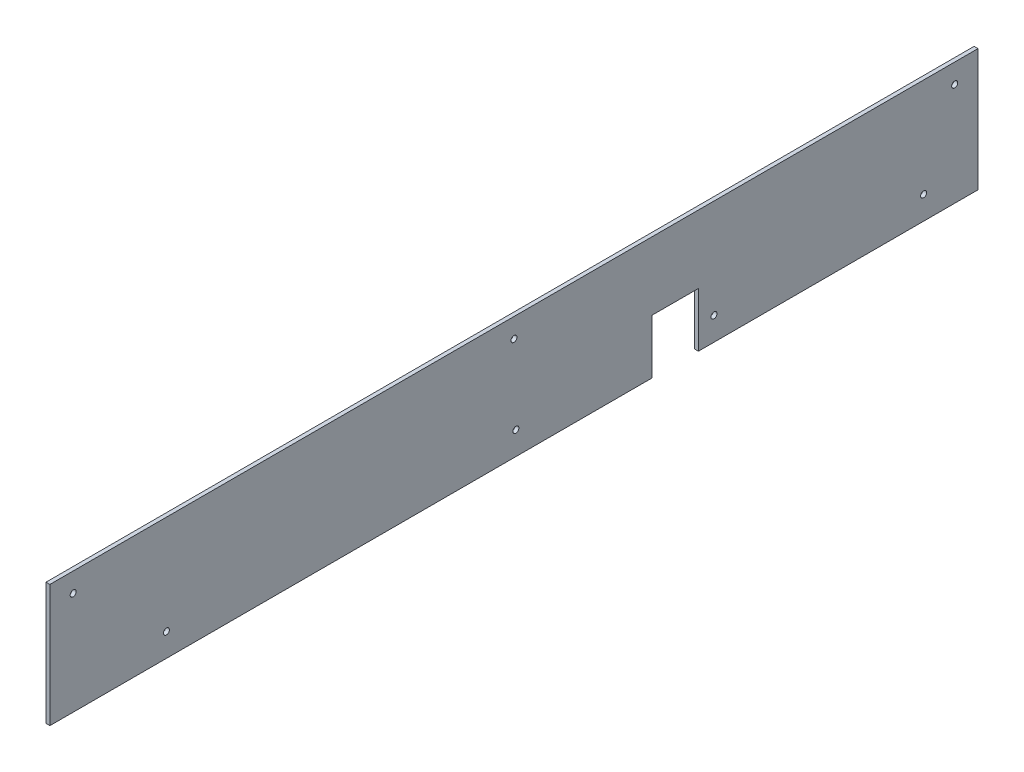
ISO-10303-21;
HEADER;
FILE_DESCRIPTION(('STEP AP214'),'2;1');
FILE_NAME('part.step','',(''),(''),'','','');
FILE_SCHEMA(('AUTOMOTIVE_DESIGN { 1 0 10303 214 1 1 1 1 }'));
ENDSEC;
DATA;
#1=APPLICATION_CONTEXT('core data for automotive mechanical design processes');
#2=APPLICATION_PROTOCOL_DEFINITION('international standard','automotive_design',2000,#1);
#3=PRODUCT_CONTEXT('',#1,'mechanical');
#4=PRODUCT('Part','Part','',(#3));
#5=PRODUCT_RELATED_PRODUCT_CATEGORY('part','',(#4));
#6=PRODUCT_DEFINITION_FORMATION('','',#4);
#7=PRODUCT_DEFINITION_CONTEXT('part definition',#1,'design');
#8=PRODUCT_DEFINITION('design','',#6,#7);
#9=PRODUCT_DEFINITION_SHAPE('','',#8);
#10=(LENGTH_UNIT() NAMED_UNIT(*) SI_UNIT(.MILLI.,.METRE.));
#11=(NAMED_UNIT(*) PLANE_ANGLE_UNIT() SI_UNIT($,.RADIAN.));
#12=(NAMED_UNIT(*) SI_UNIT($,.STERADIAN.) SOLID_ANGLE_UNIT());
#13=UNCERTAINTY_MEASURE_WITH_UNIT(LENGTH_MEASURE(1.E-05),#10,'distance_accuracy_value','');
#14=(GEOMETRIC_REPRESENTATION_CONTEXT(3) GLOBAL_UNCERTAINTY_ASSIGNED_CONTEXT((#13)) GLOBAL_UNIT_ASSIGNED_CONTEXT((#10,
#11,#12)) REPRESENTATION_CONTEXT('',''));
#15=CARTESIAN_POINT('',(0.,0.,0.));
#16=DIRECTION('',(0.,0.,1.));
#17=DIRECTION('',(1.,0.,0.));
#18=AXIS2_PLACEMENT_3D('',#15,#16,#17);
#19=CARTESIAN_POINT('',(3.175,0.,0.));
#20=DIRECTION('',(0.,1.,0.));
#21=DIRECTION('',(0.,0.,1.));
#22=AXIS2_PLACEMENT_3D('',#19,#20,#21);
#23=PLANE('',#22);
#24=DIRECTION('',(0.,0.,-1.));
#25=VECTOR('',#24,1.);
#26=CARTESIAN_POINT('',(0.,0.,0.));
#27=LINE('',#26,#25);
#28=CARTESIAN_POINT('',(0.,0.,0.));
#29=VERTEX_POINT('',#28);
#30=CARTESIAN_POINT('',(0.,0.,-492.125));
#31=VERTEX_POINT('',#30);
#32=EDGE_CURVE('E142',#29,#31,#27,.T.);
#33=ORIENTED_EDGE('',*,*,#32,.T.);
#34=DIRECTION('',(1.,0.,0.));
#35=VECTOR('',#34,1.);
#36=CARTESIAN_POINT('',(-250.825,0.,-492.125));
#37=LINE('',#36,#35);
#38=CARTESIAN_POINT('',(3.175,0.,-492.125));
#39=VERTEX_POINT('',#38);
#40=EDGE_CURVE('E176',#31,#39,#37,.T.);
#41=ORIENTED_EDGE('',*,*,#40,.T.);
#42=DIRECTION('',(0.,0.,-1.));
#43=VECTOR('',#42,1.);
#44=CARTESIAN_POINT('',(3.175,0.,0.));
#45=LINE('',#44,#43);
#46=CARTESIAN_POINT('',(3.175,0.,0.));
#47=VERTEX_POINT('',#46);
#48=EDGE_CURVE('E85',#47,#39,#45,.T.);
#49=ORIENTED_EDGE('',*,*,#48,.F.);
#50=DIRECTION('',(-1.,0.,0.));
#51=VECTOR('',#50,1.);
#52=CARTESIAN_POINT('',(3.175,0.,0.));
#53=LINE('',#52,#51);
#54=EDGE_CURVE('E152',#47,#29,#53,.T.);
#55=ORIENTED_EDGE('',*,*,#54,.T.);
#56=EDGE_LOOP('',(#33,#41,#49,#55));
#57=FACE_BOUND('',#56,.T.);
#58=ADVANCED_FACE('F32',(#57),#23,.F.);
#59=CARTESIAN_POINT('',(3.175,0.,0.));
#60=DIRECTION('',(0.,0.,-1.));
#61=DIRECTION('',(-1.,0.,0.));
#62=AXIS2_PLACEMENT_3D('',#59,#60,#61);
#63=PLANE('',#62);
#64=DIRECTION('',(0.,-1.,0.));
#65=VECTOR('',#64,1.);
#66=CARTESIAN_POINT('',(0.,0.,0.));
#67=LINE('',#66,#65);
#68=CARTESIAN_POINT('',(0.,100.0125,0.));
#69=VERTEX_POINT('',#68);
#70=EDGE_CURVE('E137',#69,#29,#67,.T.);
#71=ORIENTED_EDGE('',*,*,#70,.T.);
#72=ORIENTED_EDGE('',*,*,#54,.F.);
#73=DIRECTION('',(0.,-1.,0.));
#74=VECTOR('',#73,1.);
#75=CARTESIAN_POINT('',(3.175,0.,0.));
#76=LINE('',#75,#74);
#77=CARTESIAN_POINT('',(3.175,100.0125,0.));
#78=VERTEX_POINT('',#77);
#79=EDGE_CURVE('E128',#78,#47,#76,.T.);
#80=ORIENTED_EDGE('',*,*,#79,.F.);
#81=DIRECTION('',(-1.,0.,0.));
#82=VECTOR('',#81,1.);
#83=CARTESIAN_POINT('',(3.175,100.0125,0.));
#84=LINE('',#83,#82);
#85=EDGE_CURVE('E136',#78,#69,#84,.T.);
#86=ORIENTED_EDGE('',*,*,#85,.T.);
#87=EDGE_LOOP('',(#71,#72,#80,#86));
#88=FACE_BOUND('',#87,.T.);
#89=ADVANCED_FACE('F34',(#88),#63,.F.);
#90=CARTESIAN_POINT('',(3.175,0.,-530.225));
#91=VERTEX_POINT('',#90);
#92=CARTESIAN_POINT('',(3.175,0.,-758.825));
#93=VERTEX_POINT('',#92);
#94=EDGE_CURVE('E118',#91,#93,#45,.T.);
#95=ORIENTED_EDGE('',*,*,#94,.F.);
#96=DIRECTION('',(1.,0.,0.));
#97=VECTOR('',#96,1.);
#98=CARTESIAN_POINT('',(-250.825,0.,-530.225));
#99=LINE('',#98,#97);
#100=CARTESIAN_POINT('',(0.,0.,-530.225));
#101=VERTEX_POINT('',#100);
#102=EDGE_CURVE('E105',#101,#91,#99,.T.);
#103=ORIENTED_EDGE('',*,*,#102,.F.);
#104=CARTESIAN_POINT('',(0.,0.,-758.825));
#105=VERTEX_POINT('',#104);
#106=EDGE_CURVE('E140',#101,#105,#27,.T.);
#107=ORIENTED_EDGE('',*,*,#106,.T.);
#108=DIRECTION('',(-1.,0.,0.));
#109=VECTOR('',#108,1.);
#110=CARTESIAN_POINT('',(3.175,0.,-758.825));
#111=LINE('',#110,#109);
#112=EDGE_CURVE('E126',#93,#105,#111,.T.);
#113=ORIENTED_EDGE('',*,*,#112,.F.);
#114=EDGE_LOOP('',(#95,#103,#107,#113));
#115=FACE_BOUND('',#114,.T.);
#116=ADVANCED_FACE('F124',(#115),#23,.F.);
#117=CARTESIAN_POINT('',(3.175,0.,-758.825));
#118=DIRECTION('',(0.,0.,1.));
#119=DIRECTION('',(1.,0.,0.));
#120=AXIS2_PLACEMENT_3D('',#117,#118,#119);
#121=PLANE('',#120);
#122=DIRECTION('',(0.,1.,0.));
#123=VECTOR('',#122,1.);
#124=CARTESIAN_POINT('',(0.,0.,-758.825));
#125=LINE('',#124,#123);
#126=CARTESIAN_POINT('',(0.,100.0125,-758.825));
#127=VERTEX_POINT('',#126);
#128=EDGE_CURVE('E145',#105,#127,#125,.T.);
#129=ORIENTED_EDGE('',*,*,#128,.T.);
#130=DIRECTION('',(-1.,0.,0.));
#131=VECTOR('',#130,1.);
#132=CARTESIAN_POINT('',(3.175,100.0125,-758.825));
#133=LINE('',#132,#131);
#134=CARTESIAN_POINT('',(3.175,100.0125,-758.825));
#135=VERTEX_POINT('',#134);
#136=EDGE_CURVE('E149',#135,#127,#133,.T.);
#137=ORIENTED_EDGE('',*,*,#136,.F.);
#138=DIRECTION('',(0.,1.,0.));
#139=VECTOR('',#138,1.);
#140=CARTESIAN_POINT('',(3.175,0.,-758.825));
#141=LINE('',#140,#139);
#142=EDGE_CURVE('E130',#93,#135,#141,.T.);
#143=ORIENTED_EDGE('',*,*,#142,.F.);
#144=ORIENTED_EDGE('',*,*,#112,.T.);
#145=EDGE_LOOP('',(#129,#137,#143,#144));
#146=FACE_BOUND('',#145,.T.);
#147=ADVANCED_FACE('F165',(#146),#121,.F.);
#148=CARTESIAN_POINT('',(3.175,100.0125,0.));
#149=DIRECTION('',(0.,-1.,0.));
#150=DIRECTION('',(0.,0.,-1.));
#151=AXIS2_PLACEMENT_3D('',#148,#149,#150);
#152=PLANE('',#151);
#153=DIRECTION('',(0.,0.,1.));
#154=VECTOR('',#153,1.);
#155=CARTESIAN_POINT('',(0.,100.0125,0.));
#156=LINE('',#155,#154);
#157=EDGE_CURVE('E77',#127,#69,#156,.T.);
#158=ORIENTED_EDGE('',*,*,#157,.T.);
#159=ORIENTED_EDGE('',*,*,#85,.F.);
#160=DIRECTION('',(0.,0.,1.));
#161=VECTOR('',#160,1.);
#162=CARTESIAN_POINT('',(3.175,100.0125,0.));
#163=LINE('',#162,#161);
#164=EDGE_CURVE('E56',#135,#78,#163,.T.);
#165=ORIENTED_EDGE('',*,*,#164,.F.);
#166=ORIENTED_EDGE('',*,*,#136,.T.);
#167=EDGE_LOOP('',(#158,#159,#165,#166));
#168=FACE_BOUND('',#167,.T.);
#169=ADVANCED_FACE('F167',(#168),#152,.F.);
#170=CARTESIAN_POINT('',(3.175,0.,0.));
#171=DIRECTION('',(-1.,0.,0.));
#172=DIRECTION('',(0.,0.,1.));
#173=AXIS2_PLACEMENT_3D('',#170,#171,#172);
#174=PLANE('',#173);
#175=CARTESIAN_POINT('',(3.175,84.1375,-19.05));
#176=DIRECTION('',(1.,0.,0.));
#177=DIRECTION('',(0.,0.,-1.));
#178=AXIS2_PLACEMENT_3D('',#175,#176,#177);
#179=CIRCLE('',#178,2.45744999999999);
#180=CARTESIAN_POINT('',(3.175,84.1375,-21.50745));
#181=VERTEX_POINT('',#180);
#182=EDGE_CURVE('E178',#181,#181,#179,.T.);
#183=ORIENTED_EDGE('',*,*,#182,.F.);
#184=EDGE_LOOP('',(#183));
#185=FACE_BOUND('',#184,.T.);
#186=CARTESIAN_POINT('',(3.175,84.1375000000001,-379.4125));
#187=DIRECTION('',(1.,0.,0.));
#188=DIRECTION('',(0.,0.,-1.));
#189=AXIS2_PLACEMENT_3D('',#186,#187,#188);
#190=CIRCLE('',#189,2.45744999999999);
#191=CARTESIAN_POINT('',(3.175,84.1375000000001,-381.86995));
#192=VERTEX_POINT('',#191);
#193=EDGE_CURVE('E186',#192,#192,#190,.T.);
#194=ORIENTED_EDGE('',*,*,#193,.F.);
#195=EDGE_LOOP('',(#194));
#196=FACE_BOUND('',#195,.T.);
#197=CARTESIAN_POINT('',(3.175,84.1375000000001,-739.775));
#198=DIRECTION('',(1.,0.,0.));
#199=DIRECTION('',(0.,0.,-1.));
#200=AXIS2_PLACEMENT_3D('',#197,#198,#199);
#201=CIRCLE('',#200,2.45744999999999);
#202=CARTESIAN_POINT('',(3.175,84.1375000000001,-742.23245));
#203=VERTEX_POINT('',#202);
#204=EDGE_CURVE('E192',#203,#203,#201,.T.);
#205=ORIENTED_EDGE('',*,*,#204,.F.);
#206=EDGE_LOOP('',(#205));
#207=FACE_BOUND('',#206,.T.);
#208=CARTESIAN_POINT('',(3.175,19.05,-95.25));
#209=DIRECTION('',(1.,0.,0.));
#210=DIRECTION('',(0.,0.,-1.));
#211=AXIS2_PLACEMENT_3D('',#208,#209,#210);
#212=CIRCLE('',#211,2.45744999999999);
#213=CARTESIAN_POINT('',(3.175,19.05,-97.70745));
#214=VERTEX_POINT('',#213);
#215=EDGE_CURVE('E198',#214,#214,#212,.T.);
#216=ORIENTED_EDGE('',*,*,#215,.F.);
#217=EDGE_LOOP('',(#216));
#218=FACE_BOUND('',#217,.T.);
#219=CARTESIAN_POINT('',(3.175,19.05,-381.));
#220=DIRECTION('',(1.,0.,0.));
#221=DIRECTION('',(0.,0.,-1.));
#222=AXIS2_PLACEMENT_3D('',#219,#220,#221);
#223=CIRCLE('',#222,2.45744999999999);
#224=CARTESIAN_POINT('',(3.175,19.05,-383.45745));
#225=VERTEX_POINT('',#224);
#226=EDGE_CURVE('E204',#225,#225,#223,.T.);
#227=ORIENTED_EDGE('',*,*,#226,.F.);
#228=EDGE_LOOP('',(#227));
#229=FACE_BOUND('',#228,.T.);
#230=CARTESIAN_POINT('',(3.175,19.05,-542.9885));
#231=DIRECTION('',(1.,0.,0.));
#232=DIRECTION('',(0.,0.,-1.));
#233=AXIS2_PLACEMENT_3D('',#230,#231,#232);
#234=CIRCLE('',#233,2.45744999999999);
#235=CARTESIAN_POINT('',(3.175,19.05,-545.44595));
#236=VERTEX_POINT('',#235);
#237=EDGE_CURVE('E210',#236,#236,#234,.T.);
#238=ORIENTED_EDGE('',*,*,#237,.F.);
#239=EDGE_LOOP('',(#238));
#240=FACE_BOUND('',#239,.T.);
#241=CARTESIAN_POINT('',(3.175,19.0500000000001,-714.375));
#242=DIRECTION('',(1.,0.,0.));
#243=DIRECTION('',(0.,0.,-1.));
#244=AXIS2_PLACEMENT_3D('',#241,#242,#243);
#245=CIRCLE('',#244,2.45744999999999);
#246=CARTESIAN_POINT('',(3.175,19.0500000000001,-716.83245));
#247=VERTEX_POINT('',#246);
#248=EDGE_CURVE('E216',#247,#247,#245,.T.);
#249=ORIENTED_EDGE('',*,*,#248,.F.);
#250=EDGE_LOOP('',(#249));
#251=FACE_BOUND('',#250,.T.);
#252=ORIENTED_EDGE('',*,*,#48,.T.);
#253=DIRECTION('',(0.,-1.,0.));
#254=VECTOR('',#253,1.);
#255=CARTESIAN_POINT('',(3.175,0.,-492.125));
#256=LINE('',#255,#254);
#257=CARTESIAN_POINT('',(3.175,44.45,-492.125));
#258=VERTEX_POINT('',#257);
#259=EDGE_CURVE('E115',#258,#39,#256,.T.);
#260=ORIENTED_EDGE('',*,*,#259,.F.);
#261=DIRECTION('',(0.,0.,1.));
#262=VECTOR('',#261,1.);
#263=CARTESIAN_POINT('',(3.175,44.45,-492.125));
#264=LINE('',#263,#262);
#265=CARTESIAN_POINT('',(3.175,44.45,-530.225));
#266=VERTEX_POINT('',#265);
#267=EDGE_CURVE('E122',#266,#258,#264,.T.);
#268=ORIENTED_EDGE('',*,*,#267,.F.);
#269=DIRECTION('',(0.,1.,0.));
#270=VECTOR('',#269,1.);
#271=CARTESIAN_POINT('',(3.175,44.45,-530.225));
#272=LINE('',#271,#270);
#273=EDGE_CURVE('E108',#91,#266,#272,.T.);
#274=ORIENTED_EDGE('',*,*,#273,.F.);
#275=ORIENTED_EDGE('',*,*,#94,.T.);
#276=ORIENTED_EDGE('',*,*,#142,.T.);
#277=ORIENTED_EDGE('',*,*,#164,.T.);
#278=ORIENTED_EDGE('',*,*,#79,.T.);
#279=EDGE_LOOP('',(#252,#260,#268,#274,#275,#276,#277,#278));
#280=FACE_BOUND('',#279,.T.);
#281=ADVANCED_FACE('F117',(#185,#196,#207,#218,#229,#240,#251,#280),#174,.F.);
#282=CARTESIAN_POINT('',(0.,0.,0.));
#283=DIRECTION('',(-1.,0.,0.));
#284=DIRECTION('',(0.,0.,1.));
#285=AXIS2_PLACEMENT_3D('',#282,#283,#284);
#286=PLANE('',#285);
#287=DIRECTION('',(0.,1.,0.));
#288=VECTOR('',#287,1.);
#289=CARTESIAN_POINT('',(0.,0.,-492.125));
#290=LINE('',#289,#288);
#291=CARTESIAN_POINT('',(0.,44.45,-492.125));
#292=VERTEX_POINT('',#291);
#293=EDGE_CURVE('E11',#31,#292,#290,.T.);
#294=ORIENTED_EDGE('',*,*,#293,.F.);
#295=ORIENTED_EDGE('',*,*,#32,.F.);
#296=ORIENTED_EDGE('',*,*,#70,.F.);
#297=ORIENTED_EDGE('',*,*,#157,.F.);
#298=ORIENTED_EDGE('',*,*,#128,.F.);
#299=ORIENTED_EDGE('',*,*,#106,.F.);
#300=DIRECTION('',(0.,-1.,0.));
#301=VECTOR('',#300,1.);
#302=CARTESIAN_POINT('',(0.,0.,-530.225));
#303=LINE('',#302,#301);
#304=CARTESIAN_POINT('',(0.,44.45,-530.225));
#305=VERTEX_POINT('',#304);
#306=EDGE_CURVE('E111',#305,#101,#303,.T.);
#307=ORIENTED_EDGE('',*,*,#306,.F.);
#308=DIRECTION('',(0.,0.,-1.));
#309=VECTOR('',#308,1.);
#310=CARTESIAN_POINT('',(0.,44.45,0.));
#311=LINE('',#310,#309);
#312=EDGE_CURVE('E40',#292,#305,#311,.T.);
#313=ORIENTED_EDGE('',*,*,#312,.F.);
#314=EDGE_LOOP('',(#294,#295,#296,#297,#298,#299,#307,#313));
#315=FACE_BOUND('',#314,.T.);
#316=CARTESIAN_POINT('',(0.,84.1375,-19.05));
#317=DIRECTION('',(1.,0.,0.));
#318=DIRECTION('',(0.,0.,-1.));
#319=AXIS2_PLACEMENT_3D('',#316,#317,#318);
#320=CIRCLE('',#319,2.45745);
#321=CARTESIAN_POINT('',(0.,84.1375,-21.50745));
#322=VERTEX_POINT('',#321);
#323=EDGE_CURVE('E183',#322,#322,#320,.T.);
#324=ORIENTED_EDGE('',*,*,#323,.T.);
#325=EDGE_LOOP('',(#324));
#326=FACE_BOUND('',#325,.T.);
#327=CARTESIAN_POINT('',(0.,84.1375000000001,-379.4125));
#328=DIRECTION('',(1.,0.,0.));
#329=DIRECTION('',(0.,0.,-1.));
#330=AXIS2_PLACEMENT_3D('',#327,#328,#329);
#331=CIRCLE('',#330,2.45745);
#332=CARTESIAN_POINT('',(0.,84.1375000000001,-381.86995));
#333=VERTEX_POINT('',#332);
#334=EDGE_CURVE('E189',#333,#333,#331,.T.);
#335=ORIENTED_EDGE('',*,*,#334,.T.);
#336=EDGE_LOOP('',(#335));
#337=FACE_BOUND('',#336,.T.);
#338=CARTESIAN_POINT('',(0.,84.1375000000001,-739.775));
#339=DIRECTION('',(1.,0.,0.));
#340=DIRECTION('',(0.,0.,-1.));
#341=AXIS2_PLACEMENT_3D('',#338,#339,#340);
#342=CIRCLE('',#341,2.45745);
#343=CARTESIAN_POINT('',(0.,84.1375000000001,-742.23245));
#344=VERTEX_POINT('',#343);
#345=EDGE_CURVE('E195',#344,#344,#342,.T.);
#346=ORIENTED_EDGE('',*,*,#345,.T.);
#347=EDGE_LOOP('',(#346));
#348=FACE_BOUND('',#347,.T.);
#349=CARTESIAN_POINT('',(0.,19.05,-95.25));
#350=DIRECTION('',(1.,0.,0.));
#351=DIRECTION('',(0.,0.,-1.));
#352=AXIS2_PLACEMENT_3D('',#349,#350,#351);
#353=CIRCLE('',#352,2.45745);
#354=CARTESIAN_POINT('',(0.,19.05,-97.70745));
#355=VERTEX_POINT('',#354);
#356=EDGE_CURVE('E201',#355,#355,#353,.T.);
#357=ORIENTED_EDGE('',*,*,#356,.T.);
#358=EDGE_LOOP('',(#357));
#359=FACE_BOUND('',#358,.T.);
#360=CARTESIAN_POINT('',(0.,19.05,-381.));
#361=DIRECTION('',(1.,0.,0.));
#362=DIRECTION('',(0.,0.,-1.));
#363=AXIS2_PLACEMENT_3D('',#360,#361,#362);
#364=CIRCLE('',#363,2.45745);
#365=CARTESIAN_POINT('',(0.,19.05,-383.45745));
#366=VERTEX_POINT('',#365);
#367=EDGE_CURVE('E207',#366,#366,#364,.T.);
#368=ORIENTED_EDGE('',*,*,#367,.T.);
#369=EDGE_LOOP('',(#368));
#370=FACE_BOUND('',#369,.T.);
#371=CARTESIAN_POINT('',(0.,19.05,-542.9885));
#372=DIRECTION('',(1.,0.,0.));
#373=DIRECTION('',(0.,0.,-1.));
#374=AXIS2_PLACEMENT_3D('',#371,#372,#373);
#375=CIRCLE('',#374,2.45745);
#376=CARTESIAN_POINT('',(0.,19.05,-545.44595));
#377=VERTEX_POINT('',#376);
#378=EDGE_CURVE('E213',#377,#377,#375,.T.);
#379=ORIENTED_EDGE('',*,*,#378,.T.);
#380=EDGE_LOOP('',(#379));
#381=FACE_BOUND('',#380,.T.);
#382=CARTESIAN_POINT('',(0.,19.0500000000001,-714.375));
#383=DIRECTION('',(1.,0.,0.));
#384=DIRECTION('',(0.,0.,-1.));
#385=AXIS2_PLACEMENT_3D('',#382,#383,#384);
#386=CIRCLE('',#385,2.45745);
#387=CARTESIAN_POINT('',(0.,19.0500000000001,-716.83245));
#388=VERTEX_POINT('',#387);
#389=EDGE_CURVE('E141',#388,#388,#386,.T.);
#390=ORIENTED_EDGE('',*,*,#389,.T.);
#391=EDGE_LOOP('',(#390));
#392=FACE_BOUND('',#391,.T.);
#393=ADVANCED_FACE('F161',(#315,#326,#337,#348,#359,#370,#381,#392),#286,.T.);
#394=CARTESIAN_POINT('',(3.175,19.0500000000001,-714.375));
#395=DIRECTION('',(1.,0.,0.));
#396=DIRECTION('',(0.,0.,-1.));
#397=AXIS2_PLACEMENT_3D('',#394,#395,#396);
#398=CYLINDRICAL_SURFACE('',#397,2.45744999999999);
#399=ORIENTED_EDGE('',*,*,#389,.F.);
#400=EDGE_LOOP('',(#399));
#401=FACE_BOUND('',#400,.T.);
#402=ORIENTED_EDGE('',*,*,#248,.T.);
#403=EDGE_LOOP('',(#402));
#404=FACE_BOUND('',#403,.T.);
#405=ADVANCED_FACE('F222',(#401,#404),#398,.F.);
#406=CARTESIAN_POINT('',(3.175,19.05,-542.9885));
#407=DIRECTION('',(1.,0.,0.));
#408=DIRECTION('',(0.,0.,-1.));
#409=AXIS2_PLACEMENT_3D('',#406,#407,#408);
#410=CYLINDRICAL_SURFACE('',#409,2.45744999999999);
#411=ORIENTED_EDGE('',*,*,#378,.F.);
#412=EDGE_LOOP('',(#411));
#413=FACE_BOUND('',#412,.T.);
#414=ORIENTED_EDGE('',*,*,#237,.T.);
#415=EDGE_LOOP('',(#414));
#416=FACE_BOUND('',#415,.T.);
#417=ADVANCED_FACE('F225',(#413,#416),#410,.F.);
#418=CARTESIAN_POINT('',(3.175,19.05,-381.));
#419=DIRECTION('',(1.,0.,0.));
#420=DIRECTION('',(0.,0.,-1.));
#421=AXIS2_PLACEMENT_3D('',#418,#419,#420);
#422=CYLINDRICAL_SURFACE('',#421,2.45744999999999);
#423=ORIENTED_EDGE('',*,*,#367,.F.);
#424=EDGE_LOOP('',(#423));
#425=FACE_BOUND('',#424,.T.);
#426=ORIENTED_EDGE('',*,*,#226,.T.);
#427=EDGE_LOOP('',(#426));
#428=FACE_BOUND('',#427,.T.);
#429=ADVANCED_FACE('F273',(#425,#428),#422,.F.);
#430=CARTESIAN_POINT('',(3.175,19.05,-95.25));
#431=DIRECTION('',(1.,0.,0.));
#432=DIRECTION('',(0.,0.,-1.));
#433=AXIS2_PLACEMENT_3D('',#430,#431,#432);
#434=CYLINDRICAL_SURFACE('',#433,2.45744999999999);
#435=ORIENTED_EDGE('',*,*,#356,.F.);
#436=EDGE_LOOP('',(#435));
#437=FACE_BOUND('',#436,.T.);
#438=ORIENTED_EDGE('',*,*,#215,.T.);
#439=EDGE_LOOP('',(#438));
#440=FACE_BOUND('',#439,.T.);
#441=ADVANCED_FACE('F283',(#437,#440),#434,.F.);
#442=CARTESIAN_POINT('',(3.175,84.1375000000001,-739.775));
#443=DIRECTION('',(1.,0.,0.));
#444=DIRECTION('',(0.,0.,-1.));
#445=AXIS2_PLACEMENT_3D('',#442,#443,#444);
#446=CYLINDRICAL_SURFACE('',#445,2.45744999999999);
#447=ORIENTED_EDGE('',*,*,#345,.F.);
#448=EDGE_LOOP('',(#447));
#449=FACE_BOUND('',#448,.T.);
#450=ORIENTED_EDGE('',*,*,#204,.T.);
#451=EDGE_LOOP('',(#450));
#452=FACE_BOUND('',#451,.T.);
#453=ADVANCED_FACE('F293',(#449,#452),#446,.F.);
#454=CARTESIAN_POINT('',(3.175,84.1375000000001,-379.4125));
#455=DIRECTION('',(1.,0.,0.));
#456=DIRECTION('',(0.,0.,-1.));
#457=AXIS2_PLACEMENT_3D('',#454,#455,#456);
#458=CYLINDRICAL_SURFACE('',#457,2.45744999999999);
#459=ORIENTED_EDGE('',*,*,#334,.F.);
#460=EDGE_LOOP('',(#459));
#461=FACE_BOUND('',#460,.T.);
#462=ORIENTED_EDGE('',*,*,#193,.T.);
#463=EDGE_LOOP('',(#462));
#464=FACE_BOUND('',#463,.T.);
#465=ADVANCED_FACE('F303',(#461,#464),#458,.F.);
#466=CARTESIAN_POINT('',(3.175,84.1375,-19.05));
#467=DIRECTION('',(1.,0.,0.));
#468=DIRECTION('',(0.,0.,-1.));
#469=AXIS2_PLACEMENT_3D('',#466,#467,#468);
#470=CYLINDRICAL_SURFACE('',#469,2.45744999999999);
#471=ORIENTED_EDGE('',*,*,#323,.F.);
#472=EDGE_LOOP('',(#471));
#473=FACE_BOUND('',#472,.T.);
#474=ORIENTED_EDGE('',*,*,#182,.T.);
#475=EDGE_LOOP('',(#474));
#476=FACE_BOUND('',#475,.T.);
#477=ADVANCED_FACE('F313',(#473,#476),#470,.F.);
#478=CARTESIAN_POINT('',(-250.825,0.,-492.125));
#479=DIRECTION('',(0.,0.,1.));
#480=DIRECTION('',(1.,0.,0.));
#481=AXIS2_PLACEMENT_3D('',#478,#479,#480);
#482=PLANE('',#481);
#483=ORIENTED_EDGE('',*,*,#293,.T.);
#484=DIRECTION('',(1.,0.,0.));
#485=VECTOR('',#484,1.);
#486=CARTESIAN_POINT('',(-250.825,44.45,-492.125));
#487=LINE('',#486,#485);
#488=EDGE_CURVE('E158',#292,#258,#487,.T.);
#489=ORIENTED_EDGE('',*,*,#488,.T.);
#490=ORIENTED_EDGE('',*,*,#259,.T.);
#491=ORIENTED_EDGE('',*,*,#40,.F.);
#492=EDGE_LOOP('',(#483,#489,#490,#491));
#493=FACE_BOUND('',#492,.T.);
#494=ADVANCED_FACE('F322',(#493),#482,.F.);
#495=CARTESIAN_POINT('',(-250.825,44.45,-492.125));
#496=DIRECTION('',(0.,1.,0.));
#497=DIRECTION('',(0.,0.,1.));
#498=AXIS2_PLACEMENT_3D('',#495,#496,#497);
#499=PLANE('',#498);
#500=ORIENTED_EDGE('',*,*,#312,.T.);
#501=DIRECTION('',(1.,0.,0.));
#502=VECTOR('',#501,1.);
#503=CARTESIAN_POINT('',(-250.825,44.45,-530.225));
#504=LINE('',#503,#502);
#505=EDGE_CURVE('E47',#305,#266,#504,.T.);
#506=ORIENTED_EDGE('',*,*,#505,.T.);
#507=ORIENTED_EDGE('',*,*,#267,.T.);
#508=ORIENTED_EDGE('',*,*,#488,.F.);
#509=EDGE_LOOP('',(#500,#506,#507,#508));
#510=FACE_BOUND('',#509,.T.);
#511=ADVANCED_FACE('F157',(#510),#499,.F.);
#512=CARTESIAN_POINT('',(-250.825,44.45,-530.225));
#513=DIRECTION('',(0.,0.,-1.));
#514=DIRECTION('',(-1.,0.,0.));
#515=AXIS2_PLACEMENT_3D('',#512,#513,#514);
#516=PLANE('',#515);
#517=ORIENTED_EDGE('',*,*,#306,.T.);
#518=ORIENTED_EDGE('',*,*,#102,.T.);
#519=ORIENTED_EDGE('',*,*,#273,.T.);
#520=ORIENTED_EDGE('',*,*,#505,.F.);
#521=EDGE_LOOP('',(#517,#518,#519,#520));
#522=FACE_BOUND('',#521,.T.);
#523=ADVANCED_FACE('F107',(#522),#516,.F.);
#524=CLOSED_SHELL('',(#58,#89,#116,#147,#169,#281,#393,#405,#417,#429,#441,#453,#465,#477,#494,
#511,#523));
#525=MANIFOLD_SOLID_BREP('B2',#524);
#526=ADVANCED_BREP_SHAPE_REPRESENTATION('',(#18,#525),#14);
#527=SHAPE_DEFINITION_REPRESENTATION(#9,#526);
ENDSEC;
END-ISO-10303-21;
